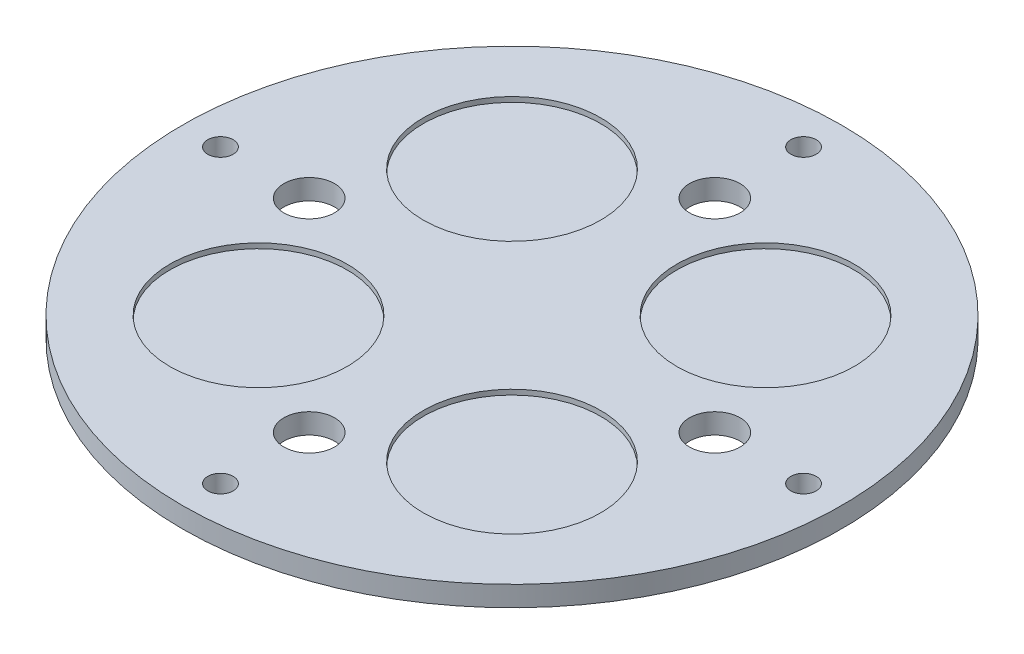
ISO-10303-21;
HEADER;
FILE_DESCRIPTION(('STEP AP214'),'2;1');
FILE_NAME('part.step','',(''),(''),'','','');
FILE_SCHEMA(('AUTOMOTIVE_DESIGN { 1 0 10303 214 1 1 1 1 }'));
ENDSEC;
DATA;
#1=APPLICATION_CONTEXT('core data for automotive mechanical design processes');
#2=APPLICATION_PROTOCOL_DEFINITION('international standard','automotive_design',2000,#1);
#3=PRODUCT_CONTEXT('',#1,'mechanical');
#4=PRODUCT('Part','Part','',(#3));
#5=PRODUCT_RELATED_PRODUCT_CATEGORY('part','',(#4));
#6=PRODUCT_DEFINITION_FORMATION('','',#4);
#7=PRODUCT_DEFINITION_CONTEXT('part definition',#1,'design');
#8=PRODUCT_DEFINITION('design','',#6,#7);
#9=PRODUCT_DEFINITION_SHAPE('','',#8);
#10=(LENGTH_UNIT() NAMED_UNIT(*) SI_UNIT(.MILLI.,.METRE.));
#11=(NAMED_UNIT(*) PLANE_ANGLE_UNIT() SI_UNIT($,.RADIAN.));
#12=(NAMED_UNIT(*) SI_UNIT($,.STERADIAN.) SOLID_ANGLE_UNIT());
#13=UNCERTAINTY_MEASURE_WITH_UNIT(LENGTH_MEASURE(1.E-05),#10,'distance_accuracy_value','');
#14=(GEOMETRIC_REPRESENTATION_CONTEXT(3) GLOBAL_UNCERTAINTY_ASSIGNED_CONTEXT((#13)) GLOBAL_UNIT_ASSIGNED_CONTEXT((#10,
#11,#12)) REPRESENTATION_CONTEXT('',''));
#15=CARTESIAN_POINT('',(0.,0.,0.));
#16=DIRECTION('',(0.,0.,1.));
#17=DIRECTION('',(1.,0.,0.));
#18=AXIS2_PLACEMENT_3D('',#15,#16,#17);
#19=CARTESIAN_POINT('',(25.,1.,25.));
#20=DIRECTION('',(0.,1.,0.));
#21=DIRECTION('',(0.,0.,1.));
#22=AXIS2_PLACEMENT_3D('',#19,#20,#21);
#23=PLANE('',#22);
#24=CARTESIAN_POINT('',(25.,1.,-32.5));
#25=DIRECTION('',(0.,1.,0.));
#26=DIRECTION('',(0.,0.,1.));
#27=AXIS2_PLACEMENT_3D('',#24,#25,#26);
#28=CIRCLE('',#27,2.5);
#29=CARTESIAN_POINT('',(25.,1.,-30.));
#30=VERTEX_POINT('',#29);
#31=EDGE_CURVE('E148',#30,#30,#28,.T.);
#32=ORIENTED_EDGE('',*,*,#31,.F.);
#33=EDGE_LOOP('',(#32));
#34=FACE_BOUND('',#33,.T.);
#35=CARTESIAN_POINT('',(82.5,1.,25.0000000000002));
#36=DIRECTION('',(0.,1.,0.));
#37=DIRECTION('',(0.,0.,1.));
#38=AXIS2_PLACEMENT_3D('',#35,#36,#37);
#39=CIRCLE('',#38,2.5);
#40=CARTESIAN_POINT('',(82.5,1.,27.5000000000002));
#41=VERTEX_POINT('',#40);
#42=EDGE_CURVE('E144',#41,#41,#39,.T.);
#43=ORIENTED_EDGE('',*,*,#42,.F.);
#44=EDGE_LOOP('',(#43));
#45=FACE_BOUND('',#44,.T.);
#46=CARTESIAN_POINT('',(24.9999999999996,1.,82.5));
#47=DIRECTION('',(0.,1.,0.));
#48=DIRECTION('',(0.,0.,1.));
#49=AXIS2_PLACEMENT_3D('',#46,#47,#48);
#50=CIRCLE('',#49,2.5);
#51=CARTESIAN_POINT('',(24.9999999999996,1.,85.));
#52=VERTEX_POINT('',#51);
#53=EDGE_CURVE('E136',#52,#52,#50,.T.);
#54=ORIENTED_EDGE('',*,*,#53,.F.);
#55=EDGE_LOOP('',(#54));
#56=FACE_BOUND('',#55,.T.);
#57=CARTESIAN_POINT('',(-32.5,1.,24.9999999999994));
#58=DIRECTION('',(0.,1.,0.));
#59=DIRECTION('',(0.,0.,1.));
#60=AXIS2_PLACEMENT_3D('',#57,#58,#59);
#61=CIRCLE('',#60,2.5);
#62=CARTESIAN_POINT('',(-32.5,1.,27.4999999999994));
#63=VERTEX_POINT('',#62);
#64=EDGE_CURVE('E128',#63,#63,#61,.T.);
#65=ORIENTED_EDGE('',*,*,#64,.F.);
#66=EDGE_LOOP('',(#65));
#67=FACE_BOUND('',#66,.T.);
#68=CARTESIAN_POINT('',(25.,1.,-15.));
#69=DIRECTION('',(0.,1.,0.));
#70=DIRECTION('',(0.,0.,1.));
#71=AXIS2_PLACEMENT_3D('',#68,#69,#70);
#72=CIRCLE('',#71,5.);
#73=CARTESIAN_POINT('',(25.,1.,-10.));
#74=VERTEX_POINT('',#73);
#75=EDGE_CURVE('E117',#74,#74,#72,.T.);
#76=ORIENTED_EDGE('',*,*,#75,.F.);
#77=EDGE_LOOP('',(#76));
#78=FACE_BOUND('',#77,.T.);
#79=CARTESIAN_POINT('',(65.,1.,25.0000000000001));
#80=DIRECTION('',(0.,1.,0.));
#81=DIRECTION('',(0.,0.,1.));
#82=AXIS2_PLACEMENT_3D('',#79,#80,#81);
#83=CIRCLE('',#82,5.);
#84=CARTESIAN_POINT('',(65.,1.,30.0000000000001));
#85=VERTEX_POINT('',#84);
#86=EDGE_CURVE('E113',#85,#85,#83,.T.);
#87=ORIENTED_EDGE('',*,*,#86,.F.);
#88=EDGE_LOOP('',(#87));
#89=FACE_BOUND('',#88,.T.);
#90=CARTESIAN_POINT('',(24.9999999999997,1.,65.));
#91=DIRECTION('',(0.,1.,0.));
#92=DIRECTION('',(0.,0.,1.));
#93=AXIS2_PLACEMENT_3D('',#90,#91,#92);
#94=CIRCLE('',#93,5.);
#95=CARTESIAN_POINT('',(24.9999999999997,1.,70.));
#96=VERTEX_POINT('',#95);
#97=EDGE_CURVE('E105',#96,#96,#94,.T.);
#98=ORIENTED_EDGE('',*,*,#97,.F.);
#99=EDGE_LOOP('',(#98));
#100=FACE_BOUND('',#99,.T.);
#101=CARTESIAN_POINT('',(-15.,1.,24.9999999999996));
#102=DIRECTION('',(0.,1.,0.));
#103=DIRECTION('',(0.,0.,1.));
#104=AXIS2_PLACEMENT_3D('',#101,#102,#103);
#105=CIRCLE('',#104,5.);
#106=CARTESIAN_POINT('',(-15.,1.,29.9999999999996));
#107=VERTEX_POINT('',#106);
#108=EDGE_CURVE('E96',#107,#107,#105,.T.);
#109=ORIENTED_EDGE('',*,*,#108,.F.);
#110=EDGE_LOOP('',(#109));
#111=FACE_BOUND('',#110,.T.);
#112=CARTESIAN_POINT('',(50.,1.,50.));
#113=DIRECTION('',(0.,1.,0.));
#114=DIRECTION('',(0.,0.,1.));
#115=AXIS2_PLACEMENT_3D('',#112,#113,#114);
#116=CIRCLE('',#115,17.5);
#117=CARTESIAN_POINT('',(50.,1.,67.5));
#118=VERTEX_POINT('',#117);
#119=EDGE_CURVE('E68',#118,#118,#116,.T.);
#120=ORIENTED_EDGE('',*,*,#119,.F.);
#121=EDGE_LOOP('',(#120));
#122=FACE_BOUND('',#121,.T.);
#123=CARTESIAN_POINT('',(0.,1.,0.));
#124=DIRECTION('',(0.,1.,0.));
#125=DIRECTION('',(0.,0.,1.));
#126=AXIS2_PLACEMENT_3D('',#123,#124,#125);
#127=CIRCLE('',#126,17.5);
#128=CARTESIAN_POINT('',(0.,1.,17.5));
#129=VERTEX_POINT('',#128);
#130=EDGE_CURVE('E51',#129,#129,#127,.T.);
#131=ORIENTED_EDGE('',*,*,#130,.F.);
#132=EDGE_LOOP('',(#131));
#133=FACE_BOUND('',#132,.T.);
#134=CARTESIAN_POINT('',(25.,1.,25.));
#135=DIRECTION('',(0.,1.,0.));
#136=DIRECTION('',(0.,0.,1.));
#137=AXIS2_PLACEMENT_3D('',#134,#135,#136);
#138=CIRCLE('',#137,65.);
#139=CARTESIAN_POINT('',(25.,1.,90.));
#140=VERTEX_POINT('',#139);
#141=EDGE_CURVE('E10',#140,#140,#138,.T.);
#142=ORIENTED_EDGE('',*,*,#141,.T.);
#143=EDGE_LOOP('',(#142));
#144=FACE_BOUND('',#143,.T.);
#145=CARTESIAN_POINT('',(50.,1.,0.));
#146=DIRECTION('',(0.,1.,0.));
#147=DIRECTION('',(0.,0.,1.));
#148=AXIS2_PLACEMENT_3D('',#145,#146,#147);
#149=CIRCLE('',#148,17.5);
#150=CARTESIAN_POINT('',(50.,1.,17.5));
#151=VERTEX_POINT('',#150);
#152=EDGE_CURVE('E62',#151,#151,#149,.T.);
#153=ORIENTED_EDGE('',*,*,#152,.F.);
#154=EDGE_LOOP('',(#153));
#155=FACE_BOUND('',#154,.T.);
#156=CARTESIAN_POINT('',(0.,1.,50.));
#157=DIRECTION('',(0.,1.,0.));
#158=DIRECTION('',(0.,0.,1.));
#159=AXIS2_PLACEMENT_3D('',#156,#157,#158);
#160=CIRCLE('',#159,17.5);
#161=CARTESIAN_POINT('',(0.,1.,67.5));
#162=VERTEX_POINT('',#161);
#163=EDGE_CURVE('E76',#162,#162,#160,.T.);
#164=ORIENTED_EDGE('',*,*,#163,.F.);
#165=EDGE_LOOP('',(#164));
#166=FACE_BOUND('',#165,.T.);
#167=ADVANCED_FACE('F43',(#34,#45,#56,#67,#78,#89,#100,#111,#122,#133,#144,#155,#166),#23,.T.);
#168=CARTESIAN_POINT('',(25.,1.,25.));
#169=DIRECTION('',(0.,-1.,0.));
#170=DIRECTION('',(0.,0.,-1.));
#171=AXIS2_PLACEMENT_3D('',#168,#169,#170);
#172=CYLINDRICAL_SURFACE('',#171,65.);
#173=ORIENTED_EDGE('',*,*,#141,.F.);
#174=EDGE_LOOP('',(#173));
#175=FACE_BOUND('',#174,.T.);
#176=CARTESIAN_POINT('',(25.,-3.,25.));
#177=DIRECTION('',(0.,-1.,0.));
#178=DIRECTION('',(0.,0.,-1.));
#179=AXIS2_PLACEMENT_3D('',#176,#177,#178);
#180=CIRCLE('',#179,65.);
#181=CARTESIAN_POINT('',(25.,-3.,-40.));
#182=VERTEX_POINT('',#181);
#183=EDGE_CURVE('E84',#182,#182,#180,.T.);
#184=ORIENTED_EDGE('',*,*,#183,.F.);
#185=EDGE_LOOP('',(#184));
#186=FACE_BOUND('',#185,.T.);
#187=ADVANCED_FACE('F45',(#175,#186),#172,.T.);
#188=CARTESIAN_POINT('',(0.,1.,0.));
#189=DIRECTION('',(0.,-1.,0.));
#190=DIRECTION('',(0.,0.,-1.));
#191=AXIS2_PLACEMENT_3D('',#188,#189,#190);
#192=CYLINDRICAL_SURFACE('',#191,17.5);
#193=ORIENTED_EDGE('',*,*,#130,.T.);
#194=EDGE_LOOP('',(#193));
#195=FACE_BOUND('',#194,.T.);
#196=CARTESIAN_POINT('',(0.,0.,0.));
#197=DIRECTION('',(0.,1.,0.));
#198=DIRECTION('',(0.,0.,1.));
#199=AXIS2_PLACEMENT_3D('',#196,#197,#198);
#200=CIRCLE('',#199,17.5);
#201=CARTESIAN_POINT('',(0.,0.,17.5));
#202=VERTEX_POINT('',#201);
#203=EDGE_CURVE('E56',#202,#202,#200,.T.);
#204=ORIENTED_EDGE('',*,*,#203,.F.);
#205=EDGE_LOOP('',(#204));
#206=FACE_BOUND('',#205,.T.);
#207=ADVANCED_FACE('F217',(#195,#206),#192,.F.);
#208=CARTESIAN_POINT('',(50.,1.,0.));
#209=DIRECTION('',(0.,-1.,0.));
#210=DIRECTION('',(0.,0.,-1.));
#211=AXIS2_PLACEMENT_3D('',#208,#209,#210);
#212=CYLINDRICAL_SURFACE('',#211,17.5);
#213=ORIENTED_EDGE('',*,*,#152,.T.);
#214=EDGE_LOOP('',(#213));
#215=FACE_BOUND('',#214,.T.);
#216=CARTESIAN_POINT('',(50.,0.,0.));
#217=DIRECTION('',(0.,1.,0.));
#218=DIRECTION('',(0.,0.,1.));
#219=AXIS2_PLACEMENT_3D('',#216,#217,#218);
#220=CIRCLE('',#219,17.5);
#221=CARTESIAN_POINT('',(50.,0.,17.5));
#222=VERTEX_POINT('',#221);
#223=EDGE_CURVE('E64',#222,#222,#220,.T.);
#224=ORIENTED_EDGE('',*,*,#223,.F.);
#225=EDGE_LOOP('',(#224));
#226=FACE_BOUND('',#225,.T.);
#227=ADVANCED_FACE('F219',(#215,#226),#212,.F.);
#228=CARTESIAN_POINT('',(50.,1.,50.));
#229=DIRECTION('',(0.,-1.,0.));
#230=DIRECTION('',(0.,0.,-1.));
#231=AXIS2_PLACEMENT_3D('',#228,#229,#230);
#232=CYLINDRICAL_SURFACE('',#231,17.5);
#233=ORIENTED_EDGE('',*,*,#119,.T.);
#234=EDGE_LOOP('',(#233));
#235=FACE_BOUND('',#234,.T.);
#236=CARTESIAN_POINT('',(50.,0.,50.));
#237=DIRECTION('',(0.,1.,0.));
#238=DIRECTION('',(0.,0.,1.));
#239=AXIS2_PLACEMENT_3D('',#236,#237,#238);
#240=CIRCLE('',#239,17.5);
#241=CARTESIAN_POINT('',(50.,0.,67.5));
#242=VERTEX_POINT('',#241);
#243=EDGE_CURVE('E72',#242,#242,#240,.T.);
#244=ORIENTED_EDGE('',*,*,#243,.F.);
#245=EDGE_LOOP('',(#244));
#246=FACE_BOUND('',#245,.T.);
#247=ADVANCED_FACE('F193',(#235,#246),#232,.F.);
#248=CARTESIAN_POINT('',(0.,1.,50.));
#249=DIRECTION('',(0.,-1.,0.));
#250=DIRECTION('',(0.,0.,-1.));
#251=AXIS2_PLACEMENT_3D('',#248,#249,#250);
#252=CYLINDRICAL_SURFACE('',#251,17.5);
#253=ORIENTED_EDGE('',*,*,#163,.T.);
#254=EDGE_LOOP('',(#253));
#255=FACE_BOUND('',#254,.T.);
#256=CARTESIAN_POINT('',(0.,0.,50.));
#257=DIRECTION('',(0.,1.,0.));
#258=DIRECTION('',(0.,0.,1.));
#259=AXIS2_PLACEMENT_3D('',#256,#257,#258);
#260=CIRCLE('',#259,17.5);
#261=CARTESIAN_POINT('',(0.,0.,67.5));
#262=VERTEX_POINT('',#261);
#263=EDGE_CURVE('E80',#262,#262,#260,.T.);
#264=ORIENTED_EDGE('',*,*,#263,.F.);
#265=EDGE_LOOP('',(#264));
#266=FACE_BOUND('',#265,.T.);
#267=ADVANCED_FACE('F189',(#255,#266),#252,.F.);
#268=CARTESIAN_POINT('',(25.,0.,25.));
#269=DIRECTION('',(0.,-1.,0.));
#270=DIRECTION('',(0.,0.,-1.));
#271=AXIS2_PLACEMENT_3D('',#268,#269,#270);
#272=PLANE('',#271);
#273=ORIENTED_EDGE('',*,*,#263,.T.);
#274=EDGE_LOOP('',(#273));
#275=FACE_BOUND('',#274,.T.);
#276=ADVANCED_FACE('F192',(#275),#272,.F.);
#277=ORIENTED_EDGE('',*,*,#243,.T.);
#278=EDGE_LOOP('',(#277));
#279=FACE_BOUND('',#278,.T.);
#280=ADVANCED_FACE('F198',(#279),#272,.F.);
#281=ORIENTED_EDGE('',*,*,#223,.T.);
#282=EDGE_LOOP('',(#281));
#283=FACE_BOUND('',#282,.T.);
#284=ADVANCED_FACE('F204',(#283),#272,.F.);
#285=ORIENTED_EDGE('',*,*,#203,.T.);
#286=EDGE_LOOP('',(#285));
#287=FACE_BOUND('',#286,.T.);
#288=ADVANCED_FACE('F200',(#287),#272,.F.);
#289=CARTESIAN_POINT('',(25.,-3.,25.));
#290=DIRECTION('',(0.,-1.,0.));
#291=DIRECTION('',(0.,0.,-1.));
#292=AXIS2_PLACEMENT_3D('',#289,#290,#291);
#293=PLANE('',#292);
#294=CARTESIAN_POINT('',(25.,-3.,-32.5));
#295=DIRECTION('',(0.,1.,0.));
#296=DIRECTION('',(0.,0.,1.));
#297=AXIS2_PLACEMENT_3D('',#294,#295,#296);
#298=CIRCLE('',#297,2.5);
#299=CARTESIAN_POINT('',(25.,-3.,-30.));
#300=VERTEX_POINT('',#299);
#301=EDGE_CURVE('E97',#300,#300,#298,.T.);
#302=ORIENTED_EDGE('',*,*,#301,.T.);
#303=EDGE_LOOP('',(#302));
#304=FACE_BOUND('',#303,.T.);
#305=CARTESIAN_POINT('',(82.5,-3.,25.0000000000002));
#306=DIRECTION('',(0.,1.,0.));
#307=DIRECTION('',(0.,0.,1.));
#308=AXIS2_PLACEMENT_3D('',#305,#306,#307);
#309=CIRCLE('',#308,2.5);
#310=CARTESIAN_POINT('',(82.5,-3.,27.5000000000002));
#311=VERTEX_POINT('',#310);
#312=EDGE_CURVE('E140',#311,#311,#309,.T.);
#313=ORIENTED_EDGE('',*,*,#312,.T.);
#314=EDGE_LOOP('',(#313));
#315=FACE_BOUND('',#314,.T.);
#316=CARTESIAN_POINT('',(24.9999999999996,-3.,82.5));
#317=DIRECTION('',(0.,1.,0.));
#318=DIRECTION('',(0.,0.,1.));
#319=AXIS2_PLACEMENT_3D('',#316,#317,#318);
#320=CIRCLE('',#319,2.5);
#321=CARTESIAN_POINT('',(24.9999999999996,-3.,85.));
#322=VERTEX_POINT('',#321);
#323=EDGE_CURVE('E132',#322,#322,#320,.T.);
#324=ORIENTED_EDGE('',*,*,#323,.T.);
#325=EDGE_LOOP('',(#324));
#326=FACE_BOUND('',#325,.T.);
#327=CARTESIAN_POINT('',(-32.5,-3.,24.9999999999994));
#328=DIRECTION('',(0.,1.,0.));
#329=DIRECTION('',(0.,0.,1.));
#330=AXIS2_PLACEMENT_3D('',#327,#328,#329);
#331=CIRCLE('',#330,2.5);
#332=CARTESIAN_POINT('',(-32.5,-3.,27.4999999999994));
#333=VERTEX_POINT('',#332);
#334=EDGE_CURVE('E124',#333,#333,#331,.T.);
#335=ORIENTED_EDGE('',*,*,#334,.T.);
#336=EDGE_LOOP('',(#335));
#337=FACE_BOUND('',#336,.T.);
#338=CARTESIAN_POINT('',(25.,-3.,-15.));
#339=DIRECTION('',(0.,1.,0.));
#340=DIRECTION('',(0.,0.,1.));
#341=AXIS2_PLACEMENT_3D('',#338,#339,#340);
#342=CIRCLE('',#341,5.);
#343=CARTESIAN_POINT('',(25.,-3.,-10.));
#344=VERTEX_POINT('',#343);
#345=EDGE_CURVE('E91',#344,#344,#342,.T.);
#346=ORIENTED_EDGE('',*,*,#345,.T.);
#347=EDGE_LOOP('',(#346));
#348=FACE_BOUND('',#347,.T.);
#349=CARTESIAN_POINT('',(65.,-3.,25.0000000000001));
#350=DIRECTION('',(0.,1.,0.));
#351=DIRECTION('',(0.,0.,1.));
#352=AXIS2_PLACEMENT_3D('',#349,#350,#351);
#353=CIRCLE('',#352,5.);
#354=CARTESIAN_POINT('',(65.,-3.,30.0000000000001));
#355=VERTEX_POINT('',#354);
#356=EDGE_CURVE('E109',#355,#355,#353,.T.);
#357=ORIENTED_EDGE('',*,*,#356,.T.);
#358=EDGE_LOOP('',(#357));
#359=FACE_BOUND('',#358,.T.);
#360=CARTESIAN_POINT('',(24.9999999999997,-3.,65.));
#361=DIRECTION('',(0.,1.,0.));
#362=DIRECTION('',(0.,0.,1.));
#363=AXIS2_PLACEMENT_3D('',#360,#361,#362);
#364=CIRCLE('',#363,5.);
#365=CARTESIAN_POINT('',(24.9999999999997,-3.,70.));
#366=VERTEX_POINT('',#365);
#367=EDGE_CURVE('E101',#366,#366,#364,.T.);
#368=ORIENTED_EDGE('',*,*,#367,.T.);
#369=EDGE_LOOP('',(#368));
#370=FACE_BOUND('',#369,.T.);
#371=CARTESIAN_POINT('',(-15.,-3.,24.9999999999996));
#372=DIRECTION('',(0.,1.,0.));
#373=DIRECTION('',(0.,0.,1.));
#374=AXIS2_PLACEMENT_3D('',#371,#372,#373);
#375=CIRCLE('',#374,5.);
#376=CARTESIAN_POINT('',(-15.,-3.,29.9999999999996));
#377=VERTEX_POINT('',#376);
#378=EDGE_CURVE('E92',#377,#377,#375,.T.);
#379=ORIENTED_EDGE('',*,*,#378,.T.);
#380=EDGE_LOOP('',(#379));
#381=FACE_BOUND('',#380,.T.);
#382=ORIENTED_EDGE('',*,*,#183,.T.);
#383=EDGE_LOOP('',(#382));
#384=FACE_BOUND('',#383,.T.);
#385=ADVANCED_FACE('F156',(#304,#315,#326,#337,#348,#359,#370,#381,#384),#293,.T.);
#386=CARTESIAN_POINT('',(-15.,-3.,24.9999999999996));
#387=DIRECTION('',(0.,1.,0.));
#388=DIRECTION('',(0.,0.,1.));
#389=AXIS2_PLACEMENT_3D('',#386,#387,#388);
#390=CYLINDRICAL_SURFACE('',#389,5.);
#391=ORIENTED_EDGE('',*,*,#378,.F.);
#392=EDGE_LOOP('',(#391));
#393=FACE_BOUND('',#392,.T.);
#394=ORIENTED_EDGE('',*,*,#108,.T.);
#395=EDGE_LOOP('',(#394));
#396=FACE_BOUND('',#395,.T.);
#397=ADVANCED_FACE('F213',(#393,#396),#390,.F.);
#398=CARTESIAN_POINT('',(24.9999999999997,-3.,65.));
#399=DIRECTION('',(0.,1.,0.));
#400=DIRECTION('',(0.,0.,1.));
#401=AXIS2_PLACEMENT_3D('',#398,#399,#400);
#402=CYLINDRICAL_SURFACE('',#401,5.);
#403=ORIENTED_EDGE('',*,*,#367,.F.);
#404=EDGE_LOOP('',(#403));
#405=FACE_BOUND('',#404,.T.);
#406=ORIENTED_EDGE('',*,*,#97,.T.);
#407=EDGE_LOOP('',(#406));
#408=FACE_BOUND('',#407,.T.);
#409=ADVANCED_FACE('F283',(#405,#408),#402,.F.);
#410=CARTESIAN_POINT('',(65.,-3.,25.0000000000001));
#411=DIRECTION('',(0.,1.,0.));
#412=DIRECTION('',(0.,0.,1.));
#413=AXIS2_PLACEMENT_3D('',#410,#411,#412);
#414=CYLINDRICAL_SURFACE('',#413,5.);
#415=ORIENTED_EDGE('',*,*,#356,.F.);
#416=EDGE_LOOP('',(#415));
#417=FACE_BOUND('',#416,.T.);
#418=ORIENTED_EDGE('',*,*,#86,.T.);
#419=EDGE_LOOP('',(#418));
#420=FACE_BOUND('',#419,.T.);
#421=ADVANCED_FACE('F294',(#417,#420),#414,.F.);
#422=CARTESIAN_POINT('',(25.,-3.,-15.));
#423=DIRECTION('',(0.,1.,0.));
#424=DIRECTION('',(0.,0.,1.));
#425=AXIS2_PLACEMENT_3D('',#422,#423,#424);
#426=CYLINDRICAL_SURFACE('',#425,5.);
#427=ORIENTED_EDGE('',*,*,#345,.F.);
#428=EDGE_LOOP('',(#427));
#429=FACE_BOUND('',#428,.T.);
#430=ORIENTED_EDGE('',*,*,#75,.T.);
#431=EDGE_LOOP('',(#430));
#432=FACE_BOUND('',#431,.T.);
#433=ADVANCED_FACE('F305',(#429,#432),#426,.F.);
#434=CARTESIAN_POINT('',(-32.5,-3.,24.9999999999994));
#435=DIRECTION('',(0.,1.,0.));
#436=DIRECTION('',(0.,0.,1.));
#437=AXIS2_PLACEMENT_3D('',#434,#435,#436);
#438=CYLINDRICAL_SURFACE('',#437,2.5);
#439=ORIENTED_EDGE('',*,*,#334,.F.);
#440=EDGE_LOOP('',(#439));
#441=FACE_BOUND('',#440,.T.);
#442=ORIENTED_EDGE('',*,*,#64,.T.);
#443=EDGE_LOOP('',(#442));
#444=FACE_BOUND('',#443,.T.);
#445=ADVANCED_FACE('F316',(#441,#444),#438,.F.);
#446=CARTESIAN_POINT('',(24.9999999999996,-3.,82.5));
#447=DIRECTION('',(0.,1.,0.));
#448=DIRECTION('',(0.,0.,1.));
#449=AXIS2_PLACEMENT_3D('',#446,#447,#448);
#450=CYLINDRICAL_SURFACE('',#449,2.5);
#451=ORIENTED_EDGE('',*,*,#323,.F.);
#452=EDGE_LOOP('',(#451));
#453=FACE_BOUND('',#452,.T.);
#454=ORIENTED_EDGE('',*,*,#53,.T.);
#455=EDGE_LOOP('',(#454));
#456=FACE_BOUND('',#455,.T.);
#457=ADVANCED_FACE('F341',(#453,#456),#450,.F.);
#458=CARTESIAN_POINT('',(82.5,-3.,25.0000000000002));
#459=DIRECTION('',(0.,1.,0.));
#460=DIRECTION('',(0.,0.,1.));
#461=AXIS2_PLACEMENT_3D('',#458,#459,#460);
#462=CYLINDRICAL_SURFACE('',#461,2.5);
#463=ORIENTED_EDGE('',*,*,#312,.F.);
#464=EDGE_LOOP('',(#463));
#465=FACE_BOUND('',#464,.T.);
#466=ORIENTED_EDGE('',*,*,#42,.T.);
#467=EDGE_LOOP('',(#466));
#468=FACE_BOUND('',#467,.T.);
#469=ADVANCED_FACE('F162',(#465,#468),#462,.F.);
#470=CARTESIAN_POINT('',(25.,-3.,-32.5));
#471=DIRECTION('',(0.,1.,0.));
#472=DIRECTION('',(0.,0.,1.));
#473=AXIS2_PLACEMENT_3D('',#470,#471,#472);
#474=CYLINDRICAL_SURFACE('',#473,2.5);
#475=ORIENTED_EDGE('',*,*,#301,.F.);
#476=EDGE_LOOP('',(#475));
#477=FACE_BOUND('',#476,.T.);
#478=ORIENTED_EDGE('',*,*,#31,.T.);
#479=EDGE_LOOP('',(#478));
#480=FACE_BOUND('',#479,.T.);
#481=ADVANCED_FACE('F159',(#477,#480),#474,.F.);
#482=CLOSED_SHELL('',(#167,#187,#207,#227,#247,#267,#276,#280,#284,#288,#385,#397,#409,#421,
#433,#445,#457,#469,#481));
#483=MANIFOLD_SOLID_BREP('B2',#482);
#484=ADVANCED_BREP_SHAPE_REPRESENTATION('',(#18,#483),#14);
#485=SHAPE_DEFINITION_REPRESENTATION(#9,#484);
ENDSEC;
END-ISO-10303-21;
